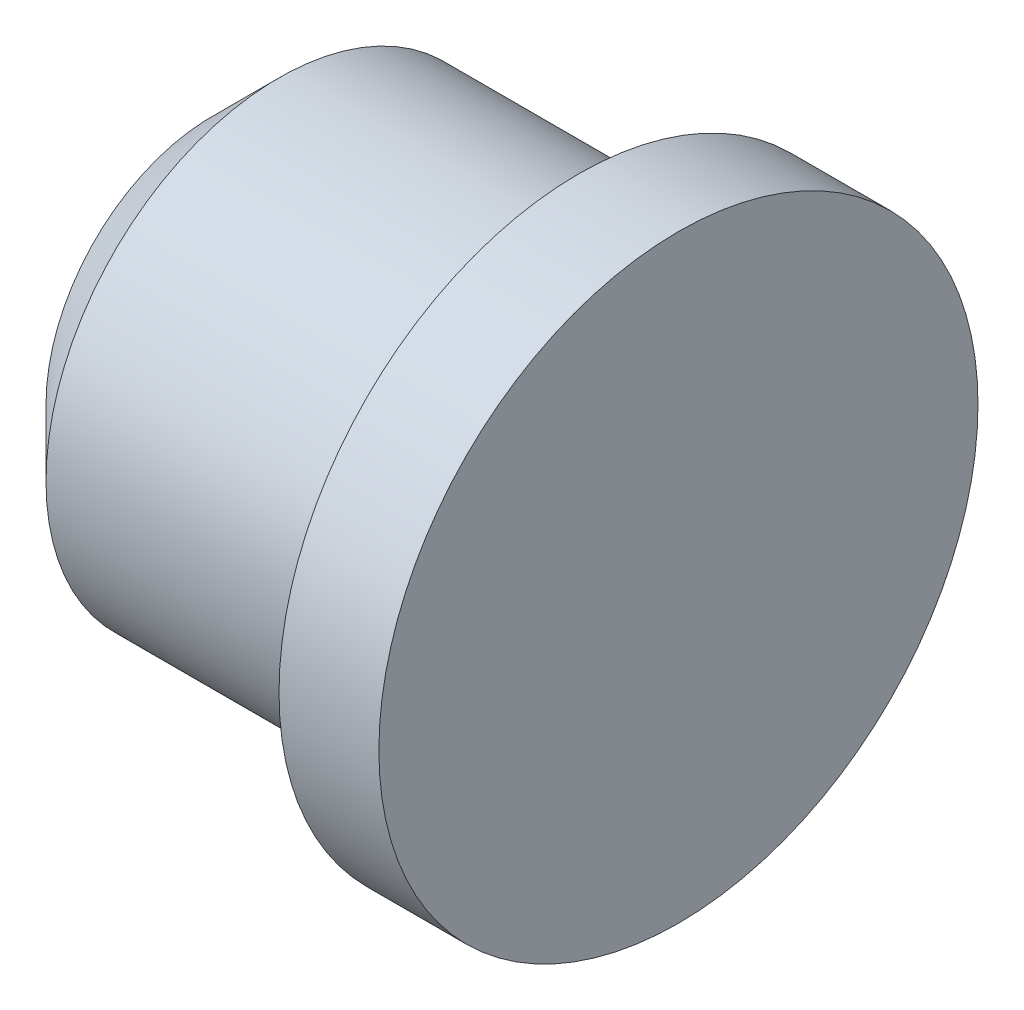
ISO-10303-21;
HEADER;
FILE_DESCRIPTION(('STEP AP214'),'2;1');
FILE_NAME('part.step','',(''),(''),'','','');
FILE_SCHEMA(('AUTOMOTIVE_DESIGN { 1 0 10303 214 1 1 1 1 }'));
ENDSEC;
DATA;
#1=APPLICATION_CONTEXT('core data for automotive mechanical design processes');
#2=APPLICATION_PROTOCOL_DEFINITION('international standard','automotive_design',2000,#1);
#3=PRODUCT_CONTEXT('',#1,'mechanical');
#4=PRODUCT('Part','Part','',(#3));
#5=PRODUCT_RELATED_PRODUCT_CATEGORY('part','',(#4));
#6=PRODUCT_DEFINITION_FORMATION('','',#4);
#7=PRODUCT_DEFINITION_CONTEXT('part definition',#1,'design');
#8=PRODUCT_DEFINITION('design','',#6,#7);
#9=PRODUCT_DEFINITION_SHAPE('','',#8);
#10=(LENGTH_UNIT() NAMED_UNIT(*) SI_UNIT(.MILLI.,.METRE.));
#11=(NAMED_UNIT(*) PLANE_ANGLE_UNIT() SI_UNIT($,.RADIAN.));
#12=(NAMED_UNIT(*) SI_UNIT($,.STERADIAN.) SOLID_ANGLE_UNIT());
#13=UNCERTAINTY_MEASURE_WITH_UNIT(LENGTH_MEASURE(1.E-05),#10,'distance_accuracy_value','');
#14=(GEOMETRIC_REPRESENTATION_CONTEXT(3) GLOBAL_UNCERTAINTY_ASSIGNED_CONTEXT((#13)) GLOBAL_UNIT_ASSIGNED_CONTEXT((#10,
#11,#12)) REPRESENTATION_CONTEXT('',''));
#15=CARTESIAN_POINT('',(0.,0.,0.));
#16=DIRECTION('',(0.,0.,1.));
#17=DIRECTION('',(1.,0.,0.));
#18=AXIS2_PLACEMENT_3D('',#15,#16,#17);
#19=CARTESIAN_POINT('',(5.24999999999999,10.75,0.));
#20=DIRECTION('',(-1.,0.,0.));
#21=DIRECTION('',(0.,0.,0.999999999999999));
#22=AXIS2_PLACEMENT_3D('',#19,#20,#21);
#23=PLANE('',#22);
#24=CARTESIAN_POINT('',(5.25,8.99999999999999,0.));
#25=DIRECTION('',(-1.,0.,0.));
#26=DIRECTION('',(0.,0.,0.999999999999999));
#27=AXIS2_PLACEMENT_3D('',#24,#25,#26);
#28=CIRCLE('',#27,1.25);
#29=CARTESIAN_POINT('',(5.25,8.99999999999999,1.25));
#30=VERTEX_POINT('',#29);
#31=EDGE_CURVE('E10',#30,#30,#28,.T.);
#32=ORIENTED_EDGE('',*,*,#31,.T.);
#33=EDGE_LOOP('',(#32));
#34=FACE_BOUND('',#33,.T.);
#35=ADVANCED_FACE('F30',(#34),#23,.T.);
#36=CARTESIAN_POINT('',(8.75,11.25,0.));
#37=DIRECTION('',(1.,0.,0.));
#38=DIRECTION('',(0.,0.,-0.999999999999999));
#39=AXIS2_PLACEMENT_3D('',#36,#37,#38);
#40=PLANE('',#39);
#41=CARTESIAN_POINT('',(8.74999999999998,8.99999999999998,0.));
#42=DIRECTION('',(1.,0.,0.));
#43=DIRECTION('',(0.,0.,-0.999999999999999));
#44=AXIS2_PLACEMENT_3D('',#41,#42,#43);
#45=CIRCLE('',#44,2.25);
#46=CARTESIAN_POINT('',(8.74999999999998,8.99999999999998,-2.25));
#47=VERTEX_POINT('',#46);
#48=EDGE_CURVE('E40',#47,#47,#45,.T.);
#49=ORIENTED_EDGE('',*,*,#48,.T.);
#50=EDGE_LOOP('',(#49));
#51=FACE_BOUND('',#50,.T.);
#52=ADVANCED_FACE('F69',(#51),#40,.T.);
#53=CARTESIAN_POINT('',(11.,8.99999999999999,0.));
#54=DIRECTION('',(1.,0.,0.));
#55=DIRECTION('',(0.,0.,-0.999999999999999));
#56=AXIS2_PLACEMENT_3D('',#53,#54,#55);
#57=CYLINDRICAL_SURFACE('',#56,2.25);
#58=CARTESIAN_POINT('',(7.99999999999998,8.99999999999999,0.));
#59=DIRECTION('',(1.,0.,0.));
#60=DIRECTION('',(0.,0.,-0.999999999999999));
#61=AXIS2_PLACEMENT_3D('',#58,#59,#60);
#62=CIRCLE('',#61,2.25);
#63=CARTESIAN_POINT('',(7.99999999999998,8.99999999999999,-2.25));
#64=VERTEX_POINT('',#63);
#65=EDGE_CURVE('E44',#64,#64,#62,.T.);
#66=ORIENTED_EDGE('',*,*,#65,.T.);
#67=EDGE_LOOP('',(#66));
#68=FACE_BOUND('',#67,.T.);
#69=ORIENTED_EDGE('',*,*,#48,.F.);
#70=EDGE_LOOP('',(#69));
#71=FACE_BOUND('',#70,.T.);
#72=ADVANCED_FACE('F66',(#68,#71),#57,.T.);
#73=CARTESIAN_POINT('',(8.00000000000001,11.25,0.));
#74=DIRECTION('',(-1.,0.,0.));
#75=DIRECTION('',(0.,0.,0.999999999999999));
#76=AXIS2_PLACEMENT_3D('',#73,#74,#75);
#77=PLANE('',#76);
#78=CARTESIAN_POINT('',(7.99999999999998,8.99999999999999,0.));
#79=DIRECTION('',(1.,0.,0.));
#80=DIRECTION('',(0.,0.,-0.999999999999999));
#81=AXIS2_PLACEMENT_3D('',#78,#79,#80);
#82=CIRCLE('',#81,1.75);
#83=CARTESIAN_POINT('',(7.99999999999998,8.99999999999999,-1.75));
#84=VERTEX_POINT('',#83);
#85=EDGE_CURVE('E49',#84,#84,#82,.T.);
#86=ORIENTED_EDGE('',*,*,#85,.T.);
#87=EDGE_LOOP('',(#86));
#88=FACE_BOUND('',#87,.T.);
#89=ORIENTED_EDGE('',*,*,#65,.F.);
#90=EDGE_LOOP('',(#89));
#91=FACE_BOUND('',#90,.T.);
#92=ADVANCED_FACE('F53',(#88,#91),#77,.T.);
#93=CARTESIAN_POINT('',(11.,8.99999999999999,0.));
#94=DIRECTION('',(1.,0.,0.));
#95=DIRECTION('',(0.,0.,-0.999999999999999));
#96=AXIS2_PLACEMENT_3D('',#93,#94,#95);
#97=CYLINDRICAL_SURFACE('',#96,1.75);
#98=CARTESIAN_POINT('',(5.75000000000001,8.99999999999999,0.));
#99=DIRECTION('',(-1.,0.,0.));
#100=DIRECTION('',(0.,0.,0.999999999999999));
#101=AXIS2_PLACEMENT_3D('',#98,#99,#100);
#102=CIRCLE('',#101,1.75);
#103=CARTESIAN_POINT('',(5.75000000000001,8.99999999999999,1.75));
#104=VERTEX_POINT('',#103);
#105=EDGE_CURVE('E36',#104,#104,#102,.F.);
#106=ORIENTED_EDGE('',*,*,#105,.T.);
#107=EDGE_LOOP('',(#106));
#108=FACE_BOUND('',#107,.T.);
#109=ORIENTED_EDGE('',*,*,#85,.F.);
#110=EDGE_LOOP('',(#109));
#111=FACE_BOUND('',#110,.T.);
#112=ADVANCED_FACE('F56',(#108,#111),#97,.T.);
#113=CARTESIAN_POINT('',(5.75000000000001,8.99999999999999,0.));
#114=DIRECTION('',(1.,0.,0.));
#115=DIRECTION('',(0.,0.,-0.999999999999999));
#116=AXIS2_PLACEMENT_3D('',#113,#114,#115);
#117=CONICAL_SURFACE('',#116,1.75,0.78539816339745);
#118=ORIENTED_EDGE('',*,*,#31,.F.);
#119=EDGE_LOOP('',(#118));
#120=FACE_BOUND('',#119,.T.);
#121=ORIENTED_EDGE('',*,*,#105,.F.);
#122=EDGE_LOOP('',(#121));
#123=FACE_BOUND('',#122,.T.);
#124=ADVANCED_FACE('F58',(#120,#123),#117,.T.);
#125=CLOSED_SHELL('',(#35,#52,#72,#92,#112,#124));
#126=MANIFOLD_SOLID_BREP('B2',#125);
#127=ADVANCED_BREP_SHAPE_REPRESENTATION('',(#18,#126),#14);
#128=SHAPE_DEFINITION_REPRESENTATION(#9,#127);
ENDSEC;
END-ISO-10303-21;
